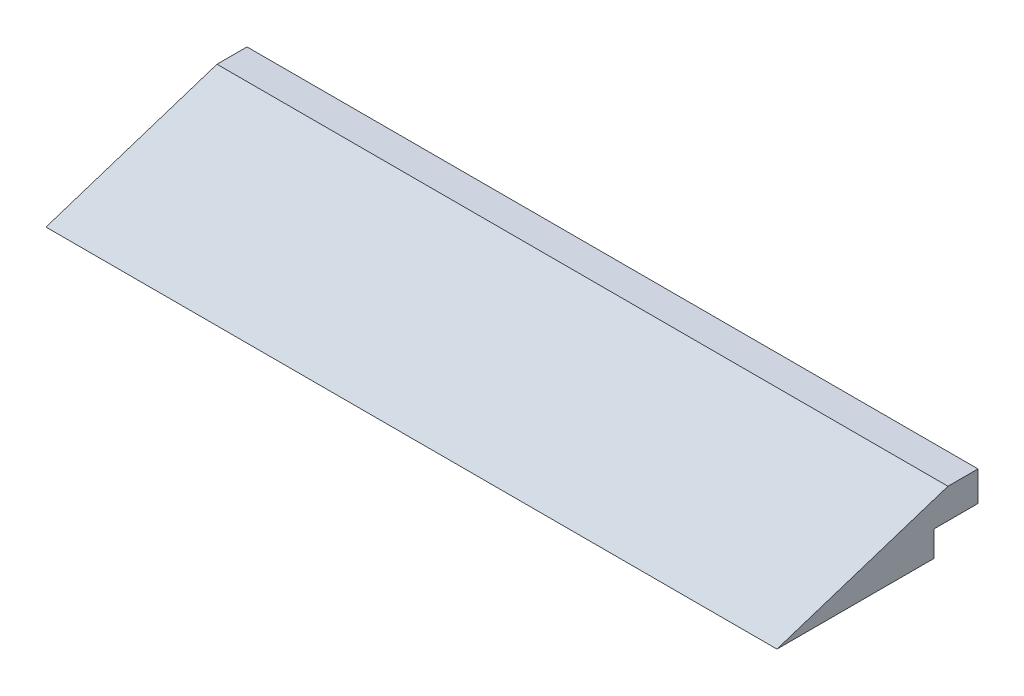
ISO-10303-21;
HEADER;
FILE_DESCRIPTION(('STEP AP214'),'2;1');
FILE_NAME('part.step','',(''),(''),'','','');
FILE_SCHEMA(('AUTOMOTIVE_DESIGN { 1 0 10303 214 1 1 1 1 }'));
ENDSEC;
DATA;
#1=APPLICATION_CONTEXT('core data for automotive mechanical design processes');
#2=APPLICATION_PROTOCOL_DEFINITION('international standard','automotive_design',2000,#1);
#3=PRODUCT_CONTEXT('',#1,'mechanical');
#4=PRODUCT('Part','Part','',(#3));
#5=PRODUCT_RELATED_PRODUCT_CATEGORY('part','',(#4));
#6=PRODUCT_DEFINITION_FORMATION('','',#4);
#7=PRODUCT_DEFINITION_CONTEXT('part definition',#1,'design');
#8=PRODUCT_DEFINITION('design','',#6,#7);
#9=PRODUCT_DEFINITION_SHAPE('','',#8);
#10=(LENGTH_UNIT() NAMED_UNIT(*) SI_UNIT(.MILLI.,.METRE.));
#11=(NAMED_UNIT(*) PLANE_ANGLE_UNIT() SI_UNIT($,.RADIAN.));
#12=(NAMED_UNIT(*) SI_UNIT($,.STERADIAN.) SOLID_ANGLE_UNIT());
#13=UNCERTAINTY_MEASURE_WITH_UNIT(LENGTH_MEASURE(1.E-05),#10,'distance_accuracy_value','');
#14=(GEOMETRIC_REPRESENTATION_CONTEXT(3) GLOBAL_UNCERTAINTY_ASSIGNED_CONTEXT((#13)) GLOBAL_UNIT_ASSIGNED_CONTEXT((#10,
#11,#12)) REPRESENTATION_CONTEXT('',''));
#15=CARTESIAN_POINT('',(0.,0.,0.));
#16=DIRECTION('',(0.,0.,1.));
#17=DIRECTION('',(1.,0.,0.));
#18=AXIS2_PLACEMENT_3D('',#15,#16,#17);
#19=CARTESIAN_POINT('',(100.,15.2,-27.5));
#20=DIRECTION('',(-1.,0.,0.));
#21=DIRECTION('',(0.,0.,1.));
#22=AXIS2_PLACEMENT_3D('',#19,#20,#21);
#23=PLANE('',#22);
#24=DIRECTION('',(0.,0.,-1.));
#25=VECTOR('',#24,1.);
#26=CARTESIAN_POINT('',(100.,0.,-27.5));
#27=LINE('',#26,#25);
#28=CARTESIAN_POINT('',(100.,0.,27.5));
#29=VERTEX_POINT('',#28);
#30=CARTESIAN_POINT('',(100.,0.,-15.5));
#31=VERTEX_POINT('',#30);
#32=EDGE_CURVE('E131',#29,#31,#27,.T.);
#33=ORIENTED_EDGE('',*,*,#32,.T.);
#34=DIRECTION('',(0.,1.,0.));
#35=VECTOR('',#34,1.);
#36=CARTESIAN_POINT('',(100.,15.2,-15.5));
#37=LINE('',#36,#35);
#38=CARTESIAN_POINT('',(100.,7.,-15.5));
#39=VERTEX_POINT('',#38);
#40=EDGE_CURVE('E56',#31,#39,#37,.T.);
#41=ORIENTED_EDGE('',*,*,#40,.T.);
#42=DIRECTION('',(0.,0.,-1.));
#43=VECTOR('',#42,1.);
#44=CARTESIAN_POINT('',(100.,7.,-27.5));
#45=LINE('',#44,#43);
#46=CARTESIAN_POINT('',(100.,7.,-27.5));
#47=VERTEX_POINT('',#46);
#48=EDGE_CURVE('E134',#39,#47,#45,.T.);
#49=ORIENTED_EDGE('',*,*,#48,.T.);
#50=DIRECTION('',(0.,-1.,0.));
#51=VECTOR('',#50,1.);
#52=CARTESIAN_POINT('',(100.,15.2,-27.5));
#53=LINE('',#52,#51);
#54=CARTESIAN_POINT('',(100.,15.2,-27.5));
#55=VERTEX_POINT('',#54);
#56=EDGE_CURVE('E11',#55,#47,#53,.T.);
#57=ORIENTED_EDGE('',*,*,#56,.F.);
#58=DIRECTION('',(0.,0.,-1.));
#59=VECTOR('',#58,1.);
#60=CARTESIAN_POINT('',(100.,15.2,-27.5));
#61=LINE('',#60,#59);
#62=CARTESIAN_POINT('',(100.,15.2,-19.2807897650637));
#63=VERTEX_POINT('',#62);
#64=EDGE_CURVE('E42',#63,#55,#61,.T.);
#65=ORIENTED_EDGE('',*,*,#64,.F.);
#66=DIRECTION('',(0.,-0.309016994374949,0.951056516295153));
#67=VECTOR('',#66,1.);
#68=CARTESIAN_POINT('',(100.,17.6155652807935,-26.7151352627338));
#69=LINE('',#68,#67);
#70=EDGE_CURVE('E143',#63,#29,#69,.T.);
#71=ORIENTED_EDGE('',*,*,#70,.T.);
#72=EDGE_LOOP('',(#33,#41,#49,#57,#65,#71));
#73=FACE_BOUND('',#72,.T.);
#74=ADVANCED_FACE('F39',(#73),#23,.F.);
#75=CARTESIAN_POINT('',(-100.,15.2,-27.5));
#76=DIRECTION('',(0.,0.,1.));
#77=DIRECTION('',(1.,0.,0.));
#78=AXIS2_PLACEMENT_3D('',#75,#76,#77);
#79=PLANE('',#78);
#80=ORIENTED_EDGE('',*,*,#56,.T.);
#81=DIRECTION('',(1.,0.,0.));
#82=VECTOR('',#81,1.);
#83=CARTESIAN_POINT('',(-100.,7.,-27.5000000000001));
#84=LINE('',#83,#82);
#85=CARTESIAN_POINT('',(-100.,7.,-27.5000000000001));
#86=VERTEX_POINT('',#85);
#87=EDGE_CURVE('E84',#86,#47,#84,.T.);
#88=ORIENTED_EDGE('',*,*,#87,.F.);
#89=DIRECTION('',(0.,-1.,0.));
#90=VECTOR('',#89,1.);
#91=CARTESIAN_POINT('',(-100.,15.2,-27.5));
#92=LINE('',#91,#90);
#93=CARTESIAN_POINT('',(-100.,15.2,-27.5));
#94=VERTEX_POINT('',#93);
#95=EDGE_CURVE('E49',#94,#86,#92,.T.);
#96=ORIENTED_EDGE('',*,*,#95,.F.);
#97=DIRECTION('',(-1.,0.,0.));
#98=VECTOR('',#97,1.);
#99=CARTESIAN_POINT('',(-100.,15.2,-27.5));
#100=LINE('',#99,#98);
#101=EDGE_CURVE('E65',#55,#94,#100,.T.);
#102=ORIENTED_EDGE('',*,*,#101,.F.);
#103=EDGE_LOOP('',(#80,#88,#96,#102));
#104=FACE_BOUND('',#103,.T.);
#105=ADVANCED_FACE('F113',(#104),#79,.F.);
#106=CARTESIAN_POINT('',(-100.,15.2,-27.5));
#107=DIRECTION('',(1.,0.,0.));
#108=DIRECTION('',(0.,0.,-1.));
#109=AXIS2_PLACEMENT_3D('',#106,#107,#108);
#110=PLANE('',#109);
#111=DIRECTION('',(0.,0.,1.));
#112=VECTOR('',#111,1.);
#113=CARTESIAN_POINT('',(-100.,7.,-27.5000000000001));
#114=LINE('',#113,#112);
#115=CARTESIAN_POINT('',(-100.,7.,-15.5));
#116=VERTEX_POINT('',#115);
#117=EDGE_CURVE('E102',#86,#116,#114,.T.);
#118=ORIENTED_EDGE('',*,*,#117,.T.);
#119=DIRECTION('',(0.,-1.,0.));
#120=VECTOR('',#119,1.);
#121=CARTESIAN_POINT('',(-100.,7.,-15.5));
#122=LINE('',#121,#120);
#123=CARTESIAN_POINT('',(-100.,0.,-15.5));
#124=VERTEX_POINT('',#123);
#125=EDGE_CURVE('E110',#116,#124,#122,.T.);
#126=ORIENTED_EDGE('',*,*,#125,.T.);
#127=DIRECTION('',(0.,0.,1.));
#128=VECTOR('',#127,1.);
#129=CARTESIAN_POINT('',(-100.,0.,-27.5));
#130=LINE('',#129,#128);
#131=CARTESIAN_POINT('',(-100.,0.,27.5));
#132=VERTEX_POINT('',#131);
#133=EDGE_CURVE('E128',#124,#132,#130,.T.);
#134=ORIENTED_EDGE('',*,*,#133,.T.);
#135=DIRECTION('',(0.,0.309016994374949,-0.951056516295153));
#136=VECTOR('',#135,1.);
#137=CARTESIAN_POINT('',(-100.,0.,27.4999999999999));
#138=LINE('',#137,#136);
#139=CARTESIAN_POINT('',(-100.,15.2,-19.2807897650637));
#140=VERTEX_POINT('',#139);
#141=EDGE_CURVE('E76',#132,#140,#138,.T.);
#142=ORIENTED_EDGE('',*,*,#141,.T.);
#143=DIRECTION('',(0.,0.,1.));
#144=VECTOR('',#143,1.);
#145=CARTESIAN_POINT('',(-100.,15.2,-27.5));
#146=LINE('',#145,#144);
#147=EDGE_CURVE('E119',#94,#140,#146,.T.);
#148=ORIENTED_EDGE('',*,*,#147,.F.);
#149=ORIENTED_EDGE('',*,*,#95,.T.);
#150=EDGE_LOOP('',(#118,#126,#134,#142,#148,#149));
#151=FACE_BOUND('',#150,.T.);
#152=ADVANCED_FACE('F118',(#151),#110,.F.);
#153=CARTESIAN_POINT('',(0.,15.2,0.));
#154=DIRECTION('',(0.,1.,0.));
#155=DIRECTION('',(0.,0.,1.));
#156=AXIS2_PLACEMENT_3D('',#153,#154,#155);
#157=PLANE('',#156);
#158=DIRECTION('',(1.,0.,0.));
#159=VECTOR('',#158,1.);
#160=CARTESIAN_POINT('',(-100.,15.2,-19.2807897650637));
#161=LINE('',#160,#159);
#162=EDGE_CURVE('E149',#140,#63,#161,.T.);
#163=ORIENTED_EDGE('',*,*,#162,.T.);
#164=ORIENTED_EDGE('',*,*,#64,.T.);
#165=ORIENTED_EDGE('',*,*,#101,.T.);
#166=ORIENTED_EDGE('',*,*,#147,.T.);
#167=EDGE_LOOP('',(#163,#164,#165,#166));
#168=FACE_BOUND('',#167,.T.);
#169=ADVANCED_FACE('F172',(#168),#157,.T.);
#170=CARTESIAN_POINT('',(0.,0.,0.));
#171=DIRECTION('',(0.,1.,0.));
#172=DIRECTION('',(0.,0.,1.));
#173=AXIS2_PLACEMENT_3D('',#170,#171,#172);
#174=PLANE('',#173);
#175=ORIENTED_EDGE('',*,*,#133,.F.);
#176=DIRECTION('',(1.,0.,0.));
#177=VECTOR('',#176,1.);
#178=CARTESIAN_POINT('',(-100.,0.,-15.5));
#179=LINE('',#178,#177);
#180=EDGE_CURVE('E156',#124,#31,#179,.T.);
#181=ORIENTED_EDGE('',*,*,#180,.T.);
#182=ORIENTED_EDGE('',*,*,#32,.F.);
#183=DIRECTION('',(1.,0.,0.));
#184=VECTOR('',#183,1.);
#185=CARTESIAN_POINT('',(-100.,0.,27.5));
#186=LINE('',#185,#184);
#187=EDGE_CURVE('E125',#132,#29,#186,.T.);
#188=ORIENTED_EDGE('',*,*,#187,.F.);
#189=EDGE_LOOP('',(#175,#181,#182,#188));
#190=FACE_BOUND('',#189,.T.);
#191=ADVANCED_FACE('F166',(#190),#174,.F.);
#192=CARTESIAN_POINT('',(-100.,9.27050983124846,-1.03169548885464));
#193=DIRECTION('',(0.,-0.951056516295153,-0.309016994374949));
#194=DIRECTION('',(0.,0.309016994374949,-0.951056516295153));
#195=AXIS2_PLACEMENT_3D('',#192,#193,#194);
#196=PLANE('',#195);
#197=ORIENTED_EDGE('',*,*,#162,.F.);
#198=ORIENTED_EDGE('',*,*,#141,.F.);
#199=ORIENTED_EDGE('',*,*,#187,.T.);
#200=ORIENTED_EDGE('',*,*,#70,.F.);
#201=EDGE_LOOP('',(#197,#198,#199,#200));
#202=FACE_BOUND('',#201,.T.);
#203=ADVANCED_FACE('F168',(#202),#196,.F.);
#204=CARTESIAN_POINT('',(-100.,7.,-27.5000000000001));
#205=DIRECTION('',(0.,1.,0.));
#206=DIRECTION('',(0.,0.,1.));
#207=AXIS2_PLACEMENT_3D('',#204,#205,#206);
#208=PLANE('',#207);
#209=DIRECTION('',(1.,0.,0.));
#210=VECTOR('',#209,1.);
#211=CARTESIAN_POINT('',(-100.,7.,-15.5));
#212=LINE('',#211,#210);
#213=EDGE_CURVE('E104',#116,#39,#212,.T.);
#214=ORIENTED_EDGE('',*,*,#213,.F.);
#215=ORIENTED_EDGE('',*,*,#117,.F.);
#216=ORIENTED_EDGE('',*,*,#87,.T.);
#217=ORIENTED_EDGE('',*,*,#48,.F.);
#218=EDGE_LOOP('',(#214,#215,#216,#217));
#219=FACE_BOUND('',#218,.T.);
#220=ADVANCED_FACE('F103',(#219),#208,.F.);
#221=CARTESIAN_POINT('',(-100.,7.,-15.5));
#222=DIRECTION('',(0.,0.,1.));
#223=DIRECTION('',(0.,-1.,0.));
#224=AXIS2_PLACEMENT_3D('',#221,#222,#223);
#225=PLANE('',#224);
#226=ORIENTED_EDGE('',*,*,#180,.F.);
#227=ORIENTED_EDGE('',*,*,#125,.F.);
#228=ORIENTED_EDGE('',*,*,#213,.T.);
#229=ORIENTED_EDGE('',*,*,#40,.F.);
#230=EDGE_LOOP('',(#226,#227,#228,#229));
#231=FACE_BOUND('',#230,.T.);
#232=ADVANCED_FACE('F219',(#231),#225,.F.);
#233=CLOSED_SHELL('',(#74,#105,#152,#169,#191,#203,#220,#232));
#234=MANIFOLD_SOLID_BREP('B2',#233);
#235=ADVANCED_BREP_SHAPE_REPRESENTATION('',(#18,#234),#14);
#236=SHAPE_DEFINITION_REPRESENTATION(#9,#235);
ENDSEC;
END-ISO-10303-21;
